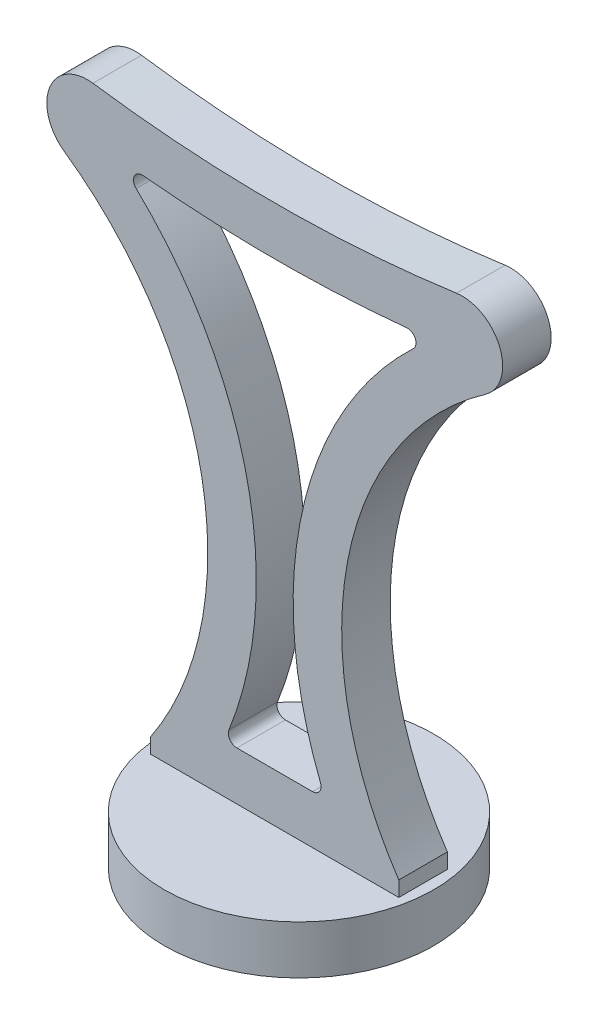
ISO-10303-21;
HEADER;
FILE_DESCRIPTION(('STEP AP214'),'2;1');
FILE_NAME('part.step','',(''),(''),'','','');
FILE_SCHEMA(('AUTOMOTIVE_DESIGN { 1 0 10303 214 1 1 1 1 }'));
ENDSEC;
DATA;
#1=APPLICATION_CONTEXT('core data for automotive mechanical design processes');
#2=APPLICATION_PROTOCOL_DEFINITION('international standard','automotive_design',2000,#1);
#3=PRODUCT_CONTEXT('',#1,'mechanical');
#4=PRODUCT('Part','Part','',(#3));
#5=PRODUCT_RELATED_PRODUCT_CATEGORY('part','',(#4));
#6=PRODUCT_DEFINITION_FORMATION('','',#4);
#7=PRODUCT_DEFINITION_CONTEXT('part definition',#1,'design');
#8=PRODUCT_DEFINITION('design','',#6,#7);
#9=PRODUCT_DEFINITION_SHAPE('','',#8);
#10=(LENGTH_UNIT() NAMED_UNIT(*) SI_UNIT(.MILLI.,.METRE.));
#11=(NAMED_UNIT(*) PLANE_ANGLE_UNIT() SI_UNIT($,.RADIAN.));
#12=(NAMED_UNIT(*) SI_UNIT($,.STERADIAN.) SOLID_ANGLE_UNIT());
#13=UNCERTAINTY_MEASURE_WITH_UNIT(LENGTH_MEASURE(1.E-05),#10,'distance_accuracy_value','');
#14=(GEOMETRIC_REPRESENTATION_CONTEXT(3) GLOBAL_UNCERTAINTY_ASSIGNED_CONTEXT((#13)) GLOBAL_UNIT_ASSIGNED_CONTEXT((#10,
#11,#12)) REPRESENTATION_CONTEXT('',''));
#15=CARTESIAN_POINT('',(0.,0.,0.));
#16=DIRECTION('',(0.,0.,1.));
#17=DIRECTION('',(1.,0.,0.));
#18=AXIS2_PLACEMENT_3D('',#15,#16,#17);
#19=CARTESIAN_POINT('',(149.830756772071,93.2251287956063,9.));
#20=DIRECTION('',(0.,0.,-1.));
#21=DIRECTION('',(-1.,0.,0.));
#22=AXIS2_PLACEMENT_3D('',#19,#20,#21);
#23=CYLINDRICAL_SURFACE('',#22,125.);
#24=CARTESIAN_POINT('',(149.830756772071,93.2251287956063,-9.));
#25=DIRECTION('',(0.,0.,-1.));
#26=DIRECTION('',(-1.,0.,0.));
#27=AXIS2_PLACEMENT_3D('',#24,#25,#26);
#28=CIRCLE('',#27,125.);
#29=CARTESIAN_POINT('',(46.,23.6250285935305,-9.));
#30=VERTEX_POINT('',#29);
#31=CARTESIAN_POINT('',(78.1037289432422,195.598140272472,-9.));
#32=VERTEX_POINT('',#31);
#33=EDGE_CURVE('E249',#30,#32,#28,.T.);
#34=ORIENTED_EDGE('',*,*,#33,.T.);
#35=DIRECTION('',(0.,0.,-1.));
#36=VECTOR('',#35,1.);
#37=CARTESIAN_POINT('',(78.1037289432422,195.598140272472,9.));
#38=LINE('',#37,#36);
#39=CARTESIAN_POINT('',(78.1037289432422,195.598140272472,9.));
#40=VERTEX_POINT('',#39);
#41=EDGE_CURVE('E403',#40,#32,#38,.T.);
#42=ORIENTED_EDGE('',*,*,#41,.F.);
#43=CARTESIAN_POINT('',(149.830756772071,93.2251287956063,9.));
#44=DIRECTION('',(0.,0.,-1.));
#45=DIRECTION('',(-1.,0.,0.));
#46=AXIS2_PLACEMENT_3D('',#43,#44,#45);
#47=CIRCLE('',#46,125.);
#48=CARTESIAN_POINT('',(46.,23.6250285935305,9.));
#49=VERTEX_POINT('',#48);
#50=EDGE_CURVE('E266',#49,#40,#47,.T.);
#51=ORIENTED_EDGE('',*,*,#50,.F.);
#52=DIRECTION('',(0.,0.,-1.));
#53=VECTOR('',#52,1.);
#54=CARTESIAN_POINT('',(46.,23.6250285935305,9.));
#55=LINE('',#54,#53);
#56=EDGE_CURVE('E310',#49,#30,#55,.T.);
#57=ORIENTED_EDGE('',*,*,#56,.T.);
#58=EDGE_LOOP('',(#34,#42,#51,#57));
#59=FACE_BOUND('',#58,.T.);
#60=ADVANCED_FACE('F53',(#59),#23,.F.);
#61=CARTESIAN_POINT('',(69.4964856037827,207.882901649695,9.));
#62=DIRECTION('',(0.,0.,-1.));
#63=DIRECTION('',(-1.,0.,0.));
#64=AXIS2_PLACEMENT_3D('',#61,#62,#63);
#65=CYLINDRICAL_SURFACE('',#64,15.);
#66=CARTESIAN_POINT('',(69.4964856037827,207.882901649695,-9.));
#67=DIRECTION('',(0.,0.,1.));
#68=DIRECTION('',(-1.,0.,0.));
#69=AXIS2_PLACEMENT_3D('',#66,#67,#68);
#70=CIRCLE('',#69,15.);
#71=CARTESIAN_POINT('',(67.3990061590006,222.735530372542,-9.));
#72=VERTEX_POINT('',#71);
#73=EDGE_CURVE('E314',#32,#72,#70,.T.);
#74=ORIENTED_EDGE('',*,*,#73,.T.);
#75=DIRECTION('',(0.,0.,-1.));
#76=VECTOR('',#75,1.);
#77=CARTESIAN_POINT('',(67.3990061590006,222.735530372542,9.));
#78=LINE('',#77,#76);
#79=CARTESIAN_POINT('',(67.3990061590006,222.735530372542,9.));
#80=VERTEX_POINT('',#79);
#81=EDGE_CURVE('E399',#80,#72,#78,.T.);
#82=ORIENTED_EDGE('',*,*,#81,.F.);
#83=CARTESIAN_POINT('',(69.4964856037827,207.882901649695,9.));
#84=DIRECTION('',(0.,0.,1.));
#85=DIRECTION('',(-1.,0.,0.));
#86=AXIS2_PLACEMENT_3D('',#83,#84,#85);
#87=CIRCLE('',#86,15.);
#88=EDGE_CURVE('E270',#40,#80,#87,.T.);
#89=ORIENTED_EDGE('',*,*,#88,.F.);
#90=ORIENTED_EDGE('',*,*,#41,.T.);
#91=EDGE_LOOP('',(#74,#82,#89,#90));
#92=FACE_BOUND('',#91,.T.);
#93=ADVANCED_FACE('F464',(#92),#65,.T.);
#94=CARTESIAN_POINT('',(0.,700.,9.));
#95=DIRECTION('',(0.,0.,-1.));
#96=DIRECTION('',(-1.,0.,0.));
#97=AXIS2_PLACEMENT_3D('',#94,#95,#96);
#98=CYLINDRICAL_SURFACE('',#97,482.);
#99=CARTESIAN_POINT('',(0.,700.,-9.));
#100=DIRECTION('',(0.,0.,-1.));
#101=DIRECTION('',(1.,0.,0.));
#102=AXIS2_PLACEMENT_3D('',#99,#100,#101);
#103=CIRCLE('',#102,482.);
#104=CARTESIAN_POINT('',(-67.3990061590005,222.735530372542,-9.));
#105=VERTEX_POINT('',#104);
#106=EDGE_CURVE('E317',#72,#105,#103,.T.);
#107=ORIENTED_EDGE('',*,*,#106,.T.);
#108=DIRECTION('',(0.,0.,-1.));
#109=VECTOR('',#108,1.);
#110=CARTESIAN_POINT('',(-67.3990061590005,222.735530372542,9.));
#111=LINE('',#110,#109);
#112=CARTESIAN_POINT('',(-67.3990061590005,222.735530372542,9.));
#113=VERTEX_POINT('',#112);
#114=EDGE_CURVE('E395',#113,#105,#111,.T.);
#115=ORIENTED_EDGE('',*,*,#114,.F.);
#116=CARTESIAN_POINT('',(0.,700.,9.));
#117=DIRECTION('',(0.,0.,-1.));
#118=DIRECTION('',(1.,0.,0.));
#119=AXIS2_PLACEMENT_3D('',#116,#117,#118);
#120=CIRCLE('',#119,482.);
#121=EDGE_CURVE('E274',#80,#113,#120,.T.);
#122=ORIENTED_EDGE('',*,*,#121,.F.);
#123=ORIENTED_EDGE('',*,*,#81,.T.);
#124=EDGE_LOOP('',(#107,#115,#122,#123));
#125=FACE_BOUND('',#124,.T.);
#126=ADVANCED_FACE('F469',(#125),#98,.F.);
#127=CARTESIAN_POINT('',(-69.4964856037827,207.882901649695,9.));
#128=DIRECTION('',(0.,0.,-1.));
#129=DIRECTION('',(-1.,0.,0.));
#130=AXIS2_PLACEMENT_3D('',#127,#128,#129);
#131=CYLINDRICAL_SURFACE('',#130,15.);
#132=CARTESIAN_POINT('',(-69.4964856037827,207.882901649695,-9.));
#133=DIRECTION('',(0.,0.,1.));
#134=DIRECTION('',(1.,0.,0.));
#135=AXIS2_PLACEMENT_3D('',#132,#133,#134);
#136=CIRCLE('',#135,15.);
#137=CARTESIAN_POINT('',(-78.1037289432423,195.598140272472,-9.));
#138=VERTEX_POINT('',#137);
#139=EDGE_CURVE('E320',#105,#138,#136,.T.);
#140=ORIENTED_EDGE('',*,*,#139,.T.);
#141=DIRECTION('',(0.,0.,-1.));
#142=VECTOR('',#141,1.);
#143=CARTESIAN_POINT('',(-78.1037289432423,195.598140272472,9.));
#144=LINE('',#143,#142);
#145=CARTESIAN_POINT('',(-78.1037289432423,195.598140272472,9.));
#146=VERTEX_POINT('',#145);
#147=EDGE_CURVE('E391',#146,#138,#144,.T.);
#148=ORIENTED_EDGE('',*,*,#147,.F.);
#149=CARTESIAN_POINT('',(-69.4964856037827,207.882901649695,9.));
#150=DIRECTION('',(0.,0.,1.));
#151=DIRECTION('',(1.,0.,0.));
#152=AXIS2_PLACEMENT_3D('',#149,#150,#151);
#153=CIRCLE('',#152,15.);
#154=EDGE_CURVE('E277',#113,#146,#153,.T.);
#155=ORIENTED_EDGE('',*,*,#154,.F.);
#156=ORIENTED_EDGE('',*,*,#114,.T.);
#157=EDGE_LOOP('',(#140,#148,#155,#156));
#158=FACE_BOUND('',#157,.T.);
#159=ADVANCED_FACE('F531',(#158),#131,.T.);
#160=CARTESIAN_POINT('',(-149.830756772071,93.2251287956063,9.));
#161=DIRECTION('',(0.,0.,-1.));
#162=DIRECTION('',(-1.,0.,0.));
#163=AXIS2_PLACEMENT_3D('',#160,#161,#162);
#164=CYLINDRICAL_SURFACE('',#163,125.);
#165=CARTESIAN_POINT('',(-149.830756772071,93.2251287956063,-9.));
#166=DIRECTION('',(0.,0.,-1.));
#167=DIRECTION('',(1.,0.,0.));
#168=AXIS2_PLACEMENT_3D('',#165,#166,#167);
#169=CIRCLE('',#168,125.);
#170=CARTESIAN_POINT('',(-46.,23.6250285935305,-9.));
#171=VERTEX_POINT('',#170);
#172=EDGE_CURVE('E323',#138,#171,#169,.T.);
#173=ORIENTED_EDGE('',*,*,#172,.T.);
#174=DIRECTION('',(0.,0.,-1.));
#175=VECTOR('',#174,1.);
#176=CARTESIAN_POINT('',(-46.,23.6250285935305,9.));
#177=LINE('',#176,#175);
#178=CARTESIAN_POINT('',(-46.,23.6250285935305,9.));
#179=VERTEX_POINT('',#178);
#180=EDGE_CURVE('E387',#179,#171,#177,.T.);
#181=ORIENTED_EDGE('',*,*,#180,.F.);
#182=CARTESIAN_POINT('',(-149.830756772071,93.2251287956063,9.));
#183=DIRECTION('',(0.,0.,-1.));
#184=DIRECTION('',(1.,0.,0.));
#185=AXIS2_PLACEMENT_3D('',#182,#183,#184);
#186=CIRCLE('',#185,125.);
#187=EDGE_CURVE('E280',#146,#179,#186,.T.);
#188=ORIENTED_EDGE('',*,*,#187,.F.);
#189=ORIENTED_EDGE('',*,*,#147,.T.);
#190=EDGE_LOOP('',(#173,#181,#188,#189));
#191=FACE_BOUND('',#190,.T.);
#192=ADVANCED_FACE('F527',(#191),#164,.F.);
#193=CARTESIAN_POINT('',(-46.,23.6250285935305,9.));
#194=DIRECTION('',(1.,0.,0.));
#195=DIRECTION('',(0.,1.,0.));
#196=AXIS2_PLACEMENT_3D('',#193,#194,#195);
#197=PLANE('',#196);
#198=DIRECTION('',(0.,-1.,0.));
#199=VECTOR('',#198,1.);
#200=CARTESIAN_POINT('',(-46.,23.6250285935305,-9.));
#201=LINE('',#200,#199);
#202=CARTESIAN_POINT('',(-46.,18.,-9.));
#203=VERTEX_POINT('',#202);
#204=EDGE_CURVE('E326',#171,#203,#201,.T.);
#205=ORIENTED_EDGE('',*,*,#204,.T.);
#206=DIRECTION('',(0.,0.,-1.));
#207=VECTOR('',#206,1.);
#208=CARTESIAN_POINT('',(-46.,18.,9.));
#209=LINE('',#208,#207);
#210=CARTESIAN_POINT('',(-46.,18.,9.));
#211=VERTEX_POINT('',#210);
#212=EDGE_CURVE('E383',#211,#203,#209,.T.);
#213=ORIENTED_EDGE('',*,*,#212,.F.);
#214=DIRECTION('',(0.,-1.,0.));
#215=VECTOR('',#214,1.);
#216=CARTESIAN_POINT('',(-46.,23.6250285935305,9.));
#217=LINE('',#216,#215);
#218=EDGE_CURVE('E283',#179,#211,#217,.T.);
#219=ORIENTED_EDGE('',*,*,#218,.F.);
#220=ORIENTED_EDGE('',*,*,#180,.T.);
#221=EDGE_LOOP('',(#205,#213,#219,#220));
#222=FACE_BOUND('',#221,.T.);
#223=ADVANCED_FACE('F522',(#222),#197,.F.);
#224=CARTESIAN_POINT('',(-18.175,18.,9.));
#225=DIRECTION('',(0.,1.,0.));
#226=DIRECTION('',(0.,0.,1.));
#227=AXIS2_PLACEMENT_3D('',#224,#225,#226);
#228=PLANE('',#227);
#229=DIRECTION('',(1.,0.,0.));
#230=VECTOR('',#229,1.);
#231=CARTESIAN_POINT('',(-18.175,18.,-9.));
#232=LINE('',#231,#230);
#233=CARTESIAN_POINT('',(-18.175,18.,-9.));
#234=VERTEX_POINT('',#233);
#235=EDGE_CURVE('E329',#203,#234,#232,.T.);
#236=ORIENTED_EDGE('',*,*,#235,.T.);
#237=DIRECTION('',(0.,0.,-1.));
#238=VECTOR('',#237,1.);
#239=CARTESIAN_POINT('',(-18.175,18.,9.));
#240=LINE('',#239,#238);
#241=CARTESIAN_POINT('',(-18.175,18.,9.));
#242=VERTEX_POINT('',#241);
#243=EDGE_CURVE('E379',#242,#234,#240,.T.);
#244=ORIENTED_EDGE('',*,*,#243,.F.);
#245=DIRECTION('',(1.,0.,0.));
#246=VECTOR('',#245,1.);
#247=CARTESIAN_POINT('',(-18.175,18.,9.));
#248=LINE('',#247,#246);
#249=EDGE_CURVE('E286',#211,#242,#248,.T.);
#250=ORIENTED_EDGE('',*,*,#249,.F.);
#251=ORIENTED_EDGE('',*,*,#212,.T.);
#252=EDGE_LOOP('',(#236,#244,#250,#251));
#253=FACE_BOUND('',#252,.T.);
#254=ADVANCED_FACE('F517',(#253),#228,.F.);
#255=CARTESIAN_POINT('',(-18.175,14.825,9.));
#256=DIRECTION('',(0.,0.,-1.));
#257=DIRECTION('',(-1.,0.,0.));
#258=AXIS2_PLACEMENT_3D('',#255,#256,#257);
#259=CYLINDRICAL_SURFACE('',#258,3.175);
#260=CARTESIAN_POINT('',(-18.175,14.825,-9.));
#261=DIRECTION('',(0.,0.,-1.));
#262=DIRECTION('',(1.,0.,0.));
#263=AXIS2_PLACEMENT_3D('',#260,#261,#262);
#264=CIRCLE('',#263,3.175);
#265=CARTESIAN_POINT('',(-15.,14.825,-9.));
#266=VERTEX_POINT('',#265);
#267=EDGE_CURVE('E332',#234,#266,#264,.T.);
#268=ORIENTED_EDGE('',*,*,#267,.T.);
#269=DIRECTION('',(0.,0.,-1.));
#270=VECTOR('',#269,1.);
#271=CARTESIAN_POINT('',(-15.,14.825,9.));
#272=LINE('',#271,#270);
#273=CARTESIAN_POINT('',(-15.,14.825,9.));
#274=VERTEX_POINT('',#273);
#275=EDGE_CURVE('E375',#274,#266,#272,.T.);
#276=ORIENTED_EDGE('',*,*,#275,.F.);
#277=CARTESIAN_POINT('',(-18.175,14.825,9.));
#278=DIRECTION('',(0.,0.,-1.));
#279=DIRECTION('',(1.,0.,0.));
#280=AXIS2_PLACEMENT_3D('',#277,#278,#279);
#281=CIRCLE('',#280,3.175);
#282=EDGE_CURVE('E289',#242,#274,#281,.T.);
#283=ORIENTED_EDGE('',*,*,#282,.F.);
#284=ORIENTED_EDGE('',*,*,#243,.T.);
#285=EDGE_LOOP('',(#268,#276,#283,#284));
#286=FACE_BOUND('',#285,.T.);
#287=ADVANCED_FACE('F513',(#286),#259,.F.);
#288=CARTESIAN_POINT('',(-15.,14.825,9.));
#289=DIRECTION('',(1.,0.,0.));
#290=DIRECTION('',(0.,1.,0.));
#291=AXIS2_PLACEMENT_3D('',#288,#289,#290);
#292=PLANE('',#291);
#293=DIRECTION('',(0.,-1.,0.));
#294=VECTOR('',#293,1.);
#295=CARTESIAN_POINT('',(-15.,14.825,-9.));
#296=LINE('',#295,#294);
#297=CARTESIAN_POINT('',(-15.,0.,-9.));
#298=VERTEX_POINT('',#297);
#299=EDGE_CURVE('E335',#266,#298,#296,.T.);
#300=ORIENTED_EDGE('',*,*,#299,.T.);
#301=DIRECTION('',(0.,0.,-1.));
#302=VECTOR('',#301,1.);
#303=CARTESIAN_POINT('',(-15.,0.,9.));
#304=LINE('',#303,#302);
#305=CARTESIAN_POINT('',(-15.,0.,9.));
#306=VERTEX_POINT('',#305);
#307=EDGE_CURVE('E371',#306,#298,#304,.T.);
#308=ORIENTED_EDGE('',*,*,#307,.F.);
#309=DIRECTION('',(0.,-1.,0.));
#310=VECTOR('',#309,1.);
#311=CARTESIAN_POINT('',(-15.,14.825,9.));
#312=LINE('',#311,#310);
#313=EDGE_CURVE('E292',#274,#306,#312,.T.);
#314=ORIENTED_EDGE('',*,*,#313,.F.);
#315=ORIENTED_EDGE('',*,*,#275,.T.);
#316=EDGE_LOOP('',(#300,#308,#314,#315));
#317=FACE_BOUND('',#316,.T.);
#318=ADVANCED_FACE('F508',(#317),#292,.F.);
#319=CARTESIAN_POINT('',(-15.,0.,9.));
#320=DIRECTION('',(0.,1.,0.));
#321=DIRECTION('',(0.,0.,1.));
#322=AXIS2_PLACEMENT_3D('',#319,#320,#321);
#323=PLANE('',#322);
#324=DIRECTION('',(1.,0.,0.));
#325=VECTOR('',#324,1.);
#326=CARTESIAN_POINT('',(-15.,0.,-9.));
#327=LINE('',#326,#325);
#328=CARTESIAN_POINT('',(15.,0.,-9.));
#329=VERTEX_POINT('',#328);
#330=EDGE_CURVE('E338',#298,#329,#327,.T.);
#331=ORIENTED_EDGE('',*,*,#330,.T.);
#332=DIRECTION('',(0.,0.,-1.));
#333=VECTOR('',#332,1.);
#334=CARTESIAN_POINT('',(15.,0.,9.));
#335=LINE('',#334,#333);
#336=CARTESIAN_POINT('',(15.,0.,9.));
#337=VERTEX_POINT('',#336);
#338=EDGE_CURVE('E367',#337,#329,#335,.T.);
#339=ORIENTED_EDGE('',*,*,#338,.F.);
#340=DIRECTION('',(1.,0.,0.));
#341=VECTOR('',#340,1.);
#342=CARTESIAN_POINT('',(-15.,0.,9.));
#343=LINE('',#342,#341);
#344=EDGE_CURVE('E295',#306,#337,#343,.T.);
#345=ORIENTED_EDGE('',*,*,#344,.F.);
#346=ORIENTED_EDGE('',*,*,#307,.T.);
#347=EDGE_LOOP('',(#331,#339,#345,#346));
#348=FACE_BOUND('',#347,.T.);
#349=ADVANCED_FACE('F502',(#348),#323,.F.);
#350=CARTESIAN_POINT('',(15.,0.,9.));
#351=DIRECTION('',(-1.,0.,0.));
#352=DIRECTION('',(0.,0.,1.));
#353=AXIS2_PLACEMENT_3D('',#350,#351,#352);
#354=PLANE('',#353);
#355=DIRECTION('',(0.,1.,0.));
#356=VECTOR('',#355,1.);
#357=CARTESIAN_POINT('',(15.,0.,-9.));
#358=LINE('',#357,#356);
#359=CARTESIAN_POINT('',(15.,14.825,-9.));
#360=VERTEX_POINT('',#359);
#361=EDGE_CURVE('E341',#329,#360,#358,.T.);
#362=ORIENTED_EDGE('',*,*,#361,.T.);
#363=DIRECTION('',(0.,0.,-1.));
#364=VECTOR('',#363,1.);
#365=CARTESIAN_POINT('',(15.,14.825,9.));
#366=LINE('',#365,#364);
#367=CARTESIAN_POINT('',(15.,14.825,9.));
#368=VERTEX_POINT('',#367);
#369=EDGE_CURVE('E363',#368,#360,#366,.T.);
#370=ORIENTED_EDGE('',*,*,#369,.F.);
#371=DIRECTION('',(0.,1.,0.));
#372=VECTOR('',#371,1.);
#373=CARTESIAN_POINT('',(15.,0.,9.));
#374=LINE('',#373,#372);
#375=EDGE_CURVE('E298',#337,#368,#374,.T.);
#376=ORIENTED_EDGE('',*,*,#375,.F.);
#377=ORIENTED_EDGE('',*,*,#338,.T.);
#378=EDGE_LOOP('',(#362,#370,#376,#377));
#379=FACE_BOUND('',#378,.T.);
#380=ADVANCED_FACE('F498',(#379),#354,.F.);
#381=CARTESIAN_POINT('',(18.175,14.825,9.));
#382=DIRECTION('',(0.,0.,-1.));
#383=DIRECTION('',(-1.,0.,0.));
#384=AXIS2_PLACEMENT_3D('',#381,#382,#383);
#385=CYLINDRICAL_SURFACE('',#384,3.175);
#386=CARTESIAN_POINT('',(18.175,14.825,-9.));
#387=DIRECTION('',(0.,0.,-1.));
#388=DIRECTION('',(-1.,0.,0.));
#389=AXIS2_PLACEMENT_3D('',#386,#387,#388);
#390=CIRCLE('',#389,3.175);
#391=CARTESIAN_POINT('',(18.175,18.,-9.));
#392=VERTEX_POINT('',#391);
#393=EDGE_CURVE('E344',#360,#392,#390,.T.);
#394=ORIENTED_EDGE('',*,*,#393,.T.);
#395=DIRECTION('',(0.,0.,-1.));
#396=VECTOR('',#395,1.);
#397=CARTESIAN_POINT('',(18.175,18.,9.));
#398=LINE('',#397,#396);
#399=CARTESIAN_POINT('',(18.175,18.,9.));
#400=VERTEX_POINT('',#399);
#401=EDGE_CURVE('E359',#400,#392,#398,.T.);
#402=ORIENTED_EDGE('',*,*,#401,.F.);
#403=CARTESIAN_POINT('',(18.175,14.825,9.));
#404=DIRECTION('',(0.,0.,-1.));
#405=DIRECTION('',(-1.,0.,0.));
#406=AXIS2_PLACEMENT_3D('',#403,#404,#405);
#407=CIRCLE('',#406,3.175);
#408=EDGE_CURVE('E301',#368,#400,#407,.T.);
#409=ORIENTED_EDGE('',*,*,#408,.F.);
#410=ORIENTED_EDGE('',*,*,#369,.T.);
#411=EDGE_LOOP('',(#394,#402,#409,#410));
#412=FACE_BOUND('',#411,.T.);
#413=ADVANCED_FACE('F493',(#412),#385,.F.);
#414=CARTESIAN_POINT('',(46.,18.,9.));
#415=DIRECTION('',(0.,1.,0.));
#416=DIRECTION('',(-1.,0.,0.));
#417=AXIS2_PLACEMENT_3D('',#414,#415,#416);
#418=PLANE('',#417);
#419=DIRECTION('',(1.,0.,0.));
#420=VECTOR('',#419,1.);
#421=CARTESIAN_POINT('',(46.,18.,-9.));
#422=LINE('',#421,#420);
#423=CARTESIAN_POINT('',(46.,18.,-9.));
#424=VERTEX_POINT('',#423);
#425=EDGE_CURVE('E347',#392,#424,#422,.T.);
#426=ORIENTED_EDGE('',*,*,#425,.T.);
#427=DIRECTION('',(0.,0.,-1.));
#428=VECTOR('',#427,1.);
#429=CARTESIAN_POINT('',(46.,18.,9.));
#430=LINE('',#429,#428);
#431=CARTESIAN_POINT('',(46.,18.,9.));
#432=VERTEX_POINT('',#431);
#433=EDGE_CURVE('E355',#432,#424,#430,.T.);
#434=ORIENTED_EDGE('',*,*,#433,.F.);
#435=DIRECTION('',(1.,0.,0.));
#436=VECTOR('',#435,1.);
#437=CARTESIAN_POINT('',(46.,18.,9.));
#438=LINE('',#437,#436);
#439=EDGE_CURVE('E304',#400,#432,#438,.T.);
#440=ORIENTED_EDGE('',*,*,#439,.F.);
#441=ORIENTED_EDGE('',*,*,#401,.T.);
#442=EDGE_LOOP('',(#426,#434,#440,#441));
#443=FACE_BOUND('',#442,.T.);
#444=ADVANCED_FACE('F487',(#443),#418,.F.);
#445=CARTESIAN_POINT('',(46.,23.6250285935305,9.));
#446=DIRECTION('',(-1.,0.,0.));
#447=DIRECTION('',(0.,-1.,0.));
#448=AXIS2_PLACEMENT_3D('',#445,#446,#447);
#449=PLANE('',#448);
#450=DIRECTION('',(0.,1.,0.));
#451=VECTOR('',#450,1.);
#452=CARTESIAN_POINT('',(46.,23.6250285935305,-9.));
#453=LINE('',#452,#451);
#454=EDGE_CURVE('E271',#424,#30,#453,.T.);
#455=ORIENTED_EDGE('',*,*,#454,.T.);
#456=ORIENTED_EDGE('',*,*,#56,.F.);
#457=DIRECTION('',(0.,1.,0.));
#458=VECTOR('',#457,1.);
#459=CARTESIAN_POINT('',(46.,23.6250285935305,9.));
#460=LINE('',#459,#458);
#461=EDGE_CURVE('E307',#432,#49,#460,.T.);
#462=ORIENTED_EDGE('',*,*,#461,.F.);
#463=ORIENTED_EDGE('',*,*,#433,.T.);
#464=EDGE_LOOP('',(#455,#456,#462,#463));
#465=FACE_BOUND('',#464,.T.);
#466=ADVANCED_FACE('F485',(#465),#449,.F.);
#467=CARTESIAN_POINT('',(149.830756772071,93.2251287956063,9.));
#468=DIRECTION('',(0.,0.,-1.));
#469=DIRECTION('',(-1.,0.,0.));
#470=AXIS2_PLACEMENT_3D('',#467,#468,#469);
#471=PLANE('',#470);
#472=CARTESIAN_POINT('',(49.1875512893508,199.234919924364,9.));
#473=DIRECTION('',(0.,0.,1.));
#474=DIRECTION('',(1.,0.,0.));
#475=AXIS2_PLACEMENT_3D('',#472,#473,#474);
#476=CIRCLE('',#475,3.17500000000004);
#477=CARTESIAN_POINT('',(51.373576104864,196.932329968258,9.));
#478=VERTEX_POINT('',#477);
#479=CARTESIAN_POINT('',(48.8771811888018,202.39471349368,9.));
#480=VERTEX_POINT('',#479);
#481=EDGE_CURVE('E214',#478,#480,#476,.T.);
#482=ORIENTED_EDGE('',*,*,#481,.F.);
#483=CARTESIAN_POINT('',(149.830756772071,93.2251287956063,9.));
#484=DIRECTION('',(0.,0.,-1.));
#485=DIRECTION('',(1.,0.,0.));
#486=AXIS2_PLACEMENT_3D('',#483,#484,#485);
#487=CIRCLE('',#486,143.);
#488=CARTESIAN_POINT('',(16.9657320552214,40.3489980087296,9.));
#489=VERTEX_POINT('',#488);
#490=EDGE_CURVE('E68',#489,#478,#487,.T.);
#491=ORIENTED_EDGE('',*,*,#490,.F.);
#492=CARTESIAN_POINT('',(14.0157568560885,39.175,9.));
#493=DIRECTION('',(0.,0.,1.));
#494=DIRECTION('',(-1.,0.,0.));
#495=AXIS2_PLACEMENT_3D('',#492,#493,#494);
#496=CIRCLE('',#495,3.175);
#497=CARTESIAN_POINT('',(14.0157568560885,36.,9.));
#498=VERTEX_POINT('',#497);
#499=EDGE_CURVE('E242',#498,#489,#496,.T.);
#500=ORIENTED_EDGE('',*,*,#499,.F.);
#501=DIRECTION('',(1.,0.,0.));
#502=VECTOR('',#501,1.);
#503=CARTESIAN_POINT('',(-14.0157568560885,36.,9.));
#504=LINE('',#503,#502);
#505=CARTESIAN_POINT('',(-14.0157568560885,36.,9.));
#506=VERTEX_POINT('',#505);
#507=EDGE_CURVE('E238',#506,#498,#504,.T.);
#508=ORIENTED_EDGE('',*,*,#507,.F.);
#509=CARTESIAN_POINT('',(-14.0157568560885,39.175,9.));
#510=DIRECTION('',(0.,0.,1.));
#511=DIRECTION('',(1.,0.,0.));
#512=AXIS2_PLACEMENT_3D('',#509,#510,#511);
#513=CIRCLE('',#512,3.17500000000001);
#514=CARTESIAN_POINT('',(-16.9657320552214,40.3489980087296,9.));
#515=VERTEX_POINT('',#514);
#516=EDGE_CURVE('E234',#515,#506,#513,.T.);
#517=ORIENTED_EDGE('',*,*,#516,.F.);
#518=CARTESIAN_POINT('',(-149.830756772071,93.2251287956063,9.));
#519=DIRECTION('',(0.,0.,-1.));
#520=DIRECTION('',(1.,0.,0.));
#521=AXIS2_PLACEMENT_3D('',#518,#519,#520);
#522=CIRCLE('',#521,143.);
#523=CARTESIAN_POINT('',(-51.3735761048641,196.932329968258,9.));
#524=VERTEX_POINT('',#523);
#525=EDGE_CURVE('E227',#524,#515,#522,.T.);
#526=ORIENTED_EDGE('',*,*,#525,.F.);
#527=CARTESIAN_POINT('',(-49.187551289351,199.234919924365,9.));
#528=DIRECTION('',(0.,0.,1.));
#529=DIRECTION('',(1.,0.,0.));
#530=AXIS2_PLACEMENT_3D('',#527,#528,#529);
#531=CIRCLE('',#530,3.17500000000008);
#532=CARTESIAN_POINT('',(-48.8771811888021,202.39471349368,9.));
#533=VERTEX_POINT('',#532);
#534=EDGE_CURVE('E223',#533,#524,#531,.T.);
#535=ORIENTED_EDGE('',*,*,#534,.F.);
#536=CARTESIAN_POINT('',(0.,700.,9.));
#537=DIRECTION('',(0.,0.,-1.));
#538=DIRECTION('',(1.,0.,0.));
#539=AXIS2_PLACEMENT_3D('',#536,#537,#538);
#540=CIRCLE('',#539,500.);
#541=EDGE_CURVE('E204',#480,#533,#540,.T.);
#542=ORIENTED_EDGE('',*,*,#541,.F.);
#543=EDGE_LOOP('',(#482,#491,#500,#508,#517,#526,#535,#542));
#544=FACE_BOUND('',#543,.T.);
#545=ORIENTED_EDGE('',*,*,#50,.T.);
#546=ORIENTED_EDGE('',*,*,#88,.T.);
#547=ORIENTED_EDGE('',*,*,#121,.T.);
#548=ORIENTED_EDGE('',*,*,#154,.T.);
#549=ORIENTED_EDGE('',*,*,#187,.T.);
#550=ORIENTED_EDGE('',*,*,#218,.T.);
#551=ORIENTED_EDGE('',*,*,#249,.T.);
#552=ORIENTED_EDGE('',*,*,#282,.T.);
#553=ORIENTED_EDGE('',*,*,#313,.T.);
#554=ORIENTED_EDGE('',*,*,#344,.T.);
#555=ORIENTED_EDGE('',*,*,#375,.T.);
#556=ORIENTED_EDGE('',*,*,#408,.T.);
#557=ORIENTED_EDGE('',*,*,#439,.T.);
#558=ORIENTED_EDGE('',*,*,#461,.T.);
#559=EDGE_LOOP('',(#545,#546,#547,#548,#549,#550,#551,#552,#553,#554,#555,#556,#557,#558));
#560=FACE_BOUND('',#559,.T.);
#561=ADVANCED_FACE('F219',(#544,#560),#471,.F.);
#562=CARTESIAN_POINT('',(149.830756772071,93.2251287956063,-9.));
#563=DIRECTION('',(0.,0.,-1.));
#564=DIRECTION('',(-1.,0.,0.));
#565=AXIS2_PLACEMENT_3D('',#562,#563,#564);
#566=PLANE('',#565);
#567=CARTESIAN_POINT('',(149.830756772071,93.2251287956063,-9.));
#568=DIRECTION('',(0.,0.,-1.));
#569=DIRECTION('',(-1.,0.,0.));
#570=AXIS2_PLACEMENT_3D('',#567,#568,#569);
#571=CIRCLE('',#570,143.);
#572=CARTESIAN_POINT('',(51.373576104864,196.932329968258,-9.00000000000001));
#573=VERTEX_POINT('',#572);
#574=CARTESIAN_POINT('',(16.9657320552214,40.3489980087296,-9.00000000000001));
#575=VERTEX_POINT('',#574);
#576=EDGE_CURVE('E12',#573,#575,#571,.F.);
#577=ORIENTED_EDGE('',*,*,#576,.F.);
#578=CARTESIAN_POINT('',(49.1875512893508,199.234919924364,-9.));
#579=DIRECTION('',(0.,0.,-1.));
#580=DIRECTION('',(-1.,0.,0.));
#581=AXIS2_PLACEMENT_3D('',#578,#579,#580);
#582=CIRCLE('',#581,3.17500000000004);
#583=CARTESIAN_POINT('',(48.8771811888018,202.39471349368,-9.));
#584=VERTEX_POINT('',#583);
#585=EDGE_CURVE('E407',#584,#573,#582,.T.);
#586=ORIENTED_EDGE('',*,*,#585,.F.);
#587=CARTESIAN_POINT('',(0.,700.,-9.));
#588=DIRECTION('',(0.,0.,-1.));
#589=DIRECTION('',(-1.,0.,0.));
#590=AXIS2_PLACEMENT_3D('',#587,#588,#589);
#591=CIRCLE('',#590,500.);
#592=CARTESIAN_POINT('',(-48.8771811888021,202.39471349368,-9.00000000000001));
#593=VERTEX_POINT('',#592);
#594=EDGE_CURVE('E207',#593,#584,#591,.F.);
#595=ORIENTED_EDGE('',*,*,#594,.F.);
#596=CARTESIAN_POINT('',(-49.187551289351,199.234919924365,-9.));
#597=DIRECTION('',(0.,0.,-1.));
#598=DIRECTION('',(-1.,0.,0.));
#599=AXIS2_PLACEMENT_3D('',#596,#597,#598);
#600=CIRCLE('',#599,3.17500000000008);
#601=CARTESIAN_POINT('',(-51.3735761048641,196.932329968258,-9.00000000000001));
#602=VERTEX_POINT('',#601);
#603=EDGE_CURVE('E412',#602,#593,#600,.T.);
#604=ORIENTED_EDGE('',*,*,#603,.F.);
#605=CARTESIAN_POINT('',(-149.830756772071,93.2251287956063,-9.));
#606=DIRECTION('',(0.,0.,-1.));
#607=DIRECTION('',(-1.,0.,0.));
#608=AXIS2_PLACEMENT_3D('',#605,#606,#607);
#609=CIRCLE('',#608,143.);
#610=CARTESIAN_POINT('',(-16.9657320552214,40.3489980087296,-9.00000000000001));
#611=VERTEX_POINT('',#610);
#612=EDGE_CURVE('E415',#611,#602,#609,.F.);
#613=ORIENTED_EDGE('',*,*,#612,.F.);
#614=CARTESIAN_POINT('',(-14.0157568560885,39.175,-9.));
#615=DIRECTION('',(0.,0.,-1.));
#616=DIRECTION('',(-1.,0.,0.));
#617=AXIS2_PLACEMENT_3D('',#614,#615,#616);
#618=CIRCLE('',#617,3.17500000000001);
#619=CARTESIAN_POINT('',(-14.0157568560885,36.,-9.00000000000001));
#620=VERTEX_POINT('',#619);
#621=EDGE_CURVE('E418',#620,#611,#618,.T.);
#622=ORIENTED_EDGE('',*,*,#621,.F.);
#623=DIRECTION('',(-1.,0.,0.));
#624=VECTOR('',#623,1.);
#625=CARTESIAN_POINT('',(149.830756772071,36.,-9.));
#626=LINE('',#625,#624);
#627=CARTESIAN_POINT('',(14.0157568560885,36.,-9.00000000000001));
#628=VERTEX_POINT('',#627);
#629=EDGE_CURVE('E421',#628,#620,#626,.T.);
#630=ORIENTED_EDGE('',*,*,#629,.F.);
#631=CARTESIAN_POINT('',(14.0157568560885,39.175,-9.));
#632=DIRECTION('',(0.,0.,-1.));
#633=DIRECTION('',(-1.,0.,0.));
#634=AXIS2_PLACEMENT_3D('',#631,#632,#633);
#635=CIRCLE('',#634,3.175);
#636=EDGE_CURVE('E61',#575,#628,#635,.T.);
#637=ORIENTED_EDGE('',*,*,#636,.F.);
#638=EDGE_LOOP('',(#577,#586,#595,#604,#613,#622,#630,#637));
#639=FACE_BOUND('',#638,.T.);
#640=ORIENTED_EDGE('',*,*,#33,.F.);
#641=ORIENTED_EDGE('',*,*,#454,.F.);
#642=ORIENTED_EDGE('',*,*,#425,.F.);
#643=ORIENTED_EDGE('',*,*,#393,.F.);
#644=ORIENTED_EDGE('',*,*,#361,.F.);
#645=ORIENTED_EDGE('',*,*,#330,.F.);
#646=ORIENTED_EDGE('',*,*,#299,.F.);
#647=ORIENTED_EDGE('',*,*,#267,.F.);
#648=ORIENTED_EDGE('',*,*,#235,.F.);
#649=ORIENTED_EDGE('',*,*,#204,.F.);
#650=ORIENTED_EDGE('',*,*,#172,.F.);
#651=ORIENTED_EDGE('',*,*,#139,.F.);
#652=ORIENTED_EDGE('',*,*,#106,.F.);
#653=ORIENTED_EDGE('',*,*,#73,.F.);
#654=EDGE_LOOP('',(#640,#641,#642,#643,#644,#645,#646,#647,#648,#649,#650,#651,#652,#653));
#655=FACE_BOUND('',#654,.T.);
#656=ADVANCED_FACE('F438',(#639,#655),#566,.T.);
#657=CARTESIAN_POINT('',(149.830756772071,93.2251287956063,-50.));
#658=DIRECTION('',(0.,0.,1.));
#659=DIRECTION('',(1.,0.,0.));
#660=AXIS2_PLACEMENT_3D('',#657,#658,#659);
#661=CYLINDRICAL_SURFACE('',#660,143.);
#662=ORIENTED_EDGE('',*,*,#576,.T.);
#663=DIRECTION('',(0.,0.,1.));
#664=VECTOR('',#663,1.);
#665=CARTESIAN_POINT('',(16.9657320552214,40.3489980087296,-50.));
#666=LINE('',#665,#664);
#667=EDGE_CURVE('E246',#575,#489,#666,.T.);
#668=ORIENTED_EDGE('',*,*,#667,.T.);
#669=ORIENTED_EDGE('',*,*,#490,.T.);
#670=DIRECTION('',(0.,0.,1.));
#671=VECTOR('',#670,1.);
#672=CARTESIAN_POINT('',(51.373576104864,196.932329968258,-50.));
#673=LINE('',#672,#671);
#674=EDGE_CURVE('E211',#573,#478,#673,.T.);
#675=ORIENTED_EDGE('',*,*,#674,.F.);
#676=EDGE_LOOP('',(#662,#668,#669,#675));
#677=FACE_BOUND('',#676,.T.);
#678=ADVANCED_FACE('F452',(#677),#661,.T.);
#679=CARTESIAN_POINT('',(14.0157568560885,39.175,-50.));
#680=DIRECTION('',(0.,0.,1.));
#681=DIRECTION('',(1.,0.,0.));
#682=AXIS2_PLACEMENT_3D('',#679,#680,#681);
#683=CYLINDRICAL_SURFACE('',#682,3.175);
#684=ORIENTED_EDGE('',*,*,#636,.T.);
#685=DIRECTION('',(0.,0.,1.));
#686=VECTOR('',#685,1.);
#687=CARTESIAN_POINT('',(14.0157568560885,36.,-50.));
#688=LINE('',#687,#686);
#689=EDGE_CURVE('E250',#628,#498,#688,.T.);
#690=ORIENTED_EDGE('',*,*,#689,.T.);
#691=ORIENTED_EDGE('',*,*,#499,.T.);
#692=ORIENTED_EDGE('',*,*,#667,.F.);
#693=EDGE_LOOP('',(#684,#690,#691,#692));
#694=FACE_BOUND('',#693,.T.);
#695=ADVANCED_FACE('F428',(#694),#683,.F.);
#696=CARTESIAN_POINT('',(-14.0157568560885,36.,-50.));
#697=DIRECTION('',(0.,-1.,0.));
#698=DIRECTION('',(1.,0.,0.));
#699=AXIS2_PLACEMENT_3D('',#696,#697,#698);
#700=PLANE('',#699);
#701=ORIENTED_EDGE('',*,*,#629,.T.);
#702=DIRECTION('',(0.,0.,1.));
#703=VECTOR('',#702,1.);
#704=CARTESIAN_POINT('',(-14.0157568560885,36.,-50.));
#705=LINE('',#704,#703);
#706=EDGE_CURVE('E253',#620,#506,#705,.T.);
#707=ORIENTED_EDGE('',*,*,#706,.T.);
#708=ORIENTED_EDGE('',*,*,#507,.T.);
#709=ORIENTED_EDGE('',*,*,#689,.F.);
#710=EDGE_LOOP('',(#701,#707,#708,#709));
#711=FACE_BOUND('',#710,.T.);
#712=ADVANCED_FACE('F433',(#711),#700,.F.);
#713=CARTESIAN_POINT('',(-14.0157568560885,39.175,-50.));
#714=DIRECTION('',(0.,0.,1.));
#715=DIRECTION('',(1.,0.,0.));
#716=AXIS2_PLACEMENT_3D('',#713,#714,#715);
#717=CYLINDRICAL_SURFACE('',#716,3.17500000000001);
#718=ORIENTED_EDGE('',*,*,#621,.T.);
#719=DIRECTION('',(0.,0.,1.));
#720=VECTOR('',#719,1.);
#721=CARTESIAN_POINT('',(-16.9657320552214,40.3489980087296,-50.));
#722=LINE('',#721,#720);
#723=EDGE_CURVE('E256',#611,#515,#722,.T.);
#724=ORIENTED_EDGE('',*,*,#723,.T.);
#725=ORIENTED_EDGE('',*,*,#516,.T.);
#726=ORIENTED_EDGE('',*,*,#706,.F.);
#727=EDGE_LOOP('',(#718,#724,#725,#726));
#728=FACE_BOUND('',#727,.T.);
#729=ADVANCED_FACE('F444',(#728),#717,.F.);
#730=CARTESIAN_POINT('',(-149.830756772071,93.2251287956063,-50.));
#731=DIRECTION('',(0.,0.,1.));
#732=DIRECTION('',(1.,0.,0.));
#733=AXIS2_PLACEMENT_3D('',#730,#731,#732);
#734=CYLINDRICAL_SURFACE('',#733,143.);
#735=ORIENTED_EDGE('',*,*,#612,.T.);
#736=DIRECTION('',(0.,0.,1.));
#737=VECTOR('',#736,1.);
#738=CARTESIAN_POINT('',(-51.3735761048641,196.932329968258,-50.));
#739=LINE('',#738,#737);
#740=EDGE_CURVE('E259',#602,#524,#739,.T.);
#741=ORIENTED_EDGE('',*,*,#740,.T.);
#742=ORIENTED_EDGE('',*,*,#525,.T.);
#743=ORIENTED_EDGE('',*,*,#723,.F.);
#744=EDGE_LOOP('',(#735,#741,#742,#743));
#745=FACE_BOUND('',#744,.T.);
#746=ADVANCED_FACE('F446',(#745),#734,.T.);
#747=CARTESIAN_POINT('',(-49.187551289351,199.234919924365,-50.));
#748=DIRECTION('',(0.,0.,1.));
#749=DIRECTION('',(1.,0.,0.));
#750=AXIS2_PLACEMENT_3D('',#747,#748,#749);
#751=CYLINDRICAL_SURFACE('',#750,3.17500000000008);
#752=ORIENTED_EDGE('',*,*,#603,.T.);
#753=DIRECTION('',(0.,0.,1.));
#754=VECTOR('',#753,1.);
#755=CARTESIAN_POINT('',(-48.8771811888021,202.39471349368,-50.));
#756=LINE('',#755,#754);
#757=EDGE_CURVE('E210',#593,#533,#756,.T.);
#758=ORIENTED_EDGE('',*,*,#757,.T.);
#759=ORIENTED_EDGE('',*,*,#534,.T.);
#760=ORIENTED_EDGE('',*,*,#740,.F.);
#761=EDGE_LOOP('',(#752,#758,#759,#760));
#762=FACE_BOUND('',#761,.T.);
#763=ADVANCED_FACE('F451',(#762),#751,.F.);
#764=CARTESIAN_POINT('',(0.,700.,-50.));
#765=DIRECTION('',(0.,0.,1.));
#766=DIRECTION('',(1.,0.,0.));
#767=AXIS2_PLACEMENT_3D('',#764,#765,#766);
#768=CYLINDRICAL_SURFACE('',#767,500.);
#769=ORIENTED_EDGE('',*,*,#594,.T.);
#770=DIRECTION('',(0.,0.,1.));
#771=VECTOR('',#770,1.);
#772=CARTESIAN_POINT('',(48.8771811888018,202.39471349368,-50.));
#773=LINE('',#772,#771);
#774=EDGE_CURVE('E76',#584,#480,#773,.T.);
#775=ORIENTED_EDGE('',*,*,#774,.T.);
#776=ORIENTED_EDGE('',*,*,#541,.T.);
#777=ORIENTED_EDGE('',*,*,#757,.F.);
#778=EDGE_LOOP('',(#769,#775,#776,#777));
#779=FACE_BOUND('',#778,.T.);
#780=ADVANCED_FACE('F201',(#779),#768,.T.);
#781=CARTESIAN_POINT('',(49.1875512893508,199.234919924364,-50.));
#782=DIRECTION('',(0.,0.,1.));
#783=DIRECTION('',(1.,0.,0.));
#784=AXIS2_PLACEMENT_3D('',#781,#782,#783);
#785=CYLINDRICAL_SURFACE('',#784,3.17500000000004);
#786=ORIENTED_EDGE('',*,*,#585,.T.);
#787=ORIENTED_EDGE('',*,*,#674,.T.);
#788=ORIENTED_EDGE('',*,*,#481,.T.);
#789=ORIENTED_EDGE('',*,*,#774,.F.);
#790=EDGE_LOOP('',(#786,#787,#788,#789));
#791=FACE_BOUND('',#790,.T.);
#792=ADVANCED_FACE('F215',(#791),#785,.F.);
#793=CLOSED_SHELL('',(#60,#93,#126,#159,#192,#223,#254,#287,#318,#349,#380,#413,#444,#466,#561,
#656,#678,#695,#712,#729,#746,#763,#780,#792));
#794=MANIFOLD_SOLID_BREP('B2',#793);
#795=CARTESIAN_POINT('',(0.,18.,0.));
#796=DIRECTION('',(0.,-1.,0.));
#797=DIRECTION('',(0.,0.,-1.));
#798=AXIS2_PLACEMENT_3D('',#795,#796,#797);
#799=CYLINDRICAL_SURFACE('',#798,50.);
#800=CARTESIAN_POINT('',(0.,18.,0.));
#801=DIRECTION('',(0.,1.,0.));
#802=DIRECTION('',(0.,0.,1.));
#803=AXIS2_PLACEMENT_3D('',#800,#801,#802);
#804=CIRCLE('',#803,50.);
#805=CARTESIAN_POINT('',(0.,18.,50.));
#806=VERTEX_POINT('',#805);
#807=EDGE_CURVE('E836',#806,#806,#804,.T.);
#808=ORIENTED_EDGE('',*,*,#807,.F.);
#809=EDGE_LOOP('',(#808));
#810=FACE_BOUND('',#809,.T.);
#811=CARTESIAN_POINT('',(0.,0.,0.));
#812=DIRECTION('',(0.,1.,0.));
#813=DIRECTION('',(0.,0.,1.));
#814=AXIS2_PLACEMENT_3D('',#811,#812,#813);
#815=CIRCLE('',#814,50.);
#816=CARTESIAN_POINT('',(0.,0.,50.));
#817=VERTEX_POINT('',#816);
#818=EDGE_CURVE('E835',#817,#817,#815,.T.);
#819=ORIENTED_EDGE('',*,*,#818,.T.);
#820=EDGE_LOOP('',(#819));
#821=FACE_BOUND('',#820,.T.);
#822=ADVANCED_FACE('F713',(#810,#821),#799,.T.);
#823=CARTESIAN_POINT('',(0.,18.,0.));
#824=DIRECTION('',(0.,1.,0.));
#825=DIRECTION('',(0.,0.,1.));
#826=AXIS2_PLACEMENT_3D('',#823,#824,#825);
#827=PLANE('',#826);
#828=DIRECTION('',(-1.,0.,0.));
#829=VECTOR('',#828,1.);
#830=CARTESIAN_POINT('',(0.,18.,-9.));
#831=LINE('',#830,#829);
#832=CARTESIAN_POINT('',(19.,18.,-9.));
#833=VERTEX_POINT('',#832);
#834=CARTESIAN_POINT('',(-19.,18.,-9.));
#835=VERTEX_POINT('',#834);
#836=EDGE_CURVE('E833',#833,#835,#831,.T.);
#837=ORIENTED_EDGE('',*,*,#836,.F.);
#838=DIRECTION('',(0.,0.,1.));
#839=VECTOR('',#838,1.);
#840=CARTESIAN_POINT('',(19.,18.,9.));
#841=LINE('',#840,#839);
#842=CARTESIAN_POINT('',(19.,18.,9.));
#843=VERTEX_POINT('',#842);
#844=EDGE_CURVE('E847',#833,#843,#841,.T.);
#845=ORIENTED_EDGE('',*,*,#844,.T.);
#846=DIRECTION('',(1.,0.,0.));
#847=VECTOR('',#846,1.);
#848=CARTESIAN_POINT('',(0.,18.,9.));
#849=LINE('',#848,#847);
#850=CARTESIAN_POINT('',(-19.,18.,9.));
#851=VERTEX_POINT('',#850);
#852=EDGE_CURVE('E827',#851,#843,#849,.T.);
#853=ORIENTED_EDGE('',*,*,#852,.F.);
#854=DIRECTION('',(0.,0.,-1.));
#855=VECTOR('',#854,1.);
#856=CARTESIAN_POINT('',(-19.,18.,-9.));
#857=LINE('',#856,#855);
#858=EDGE_CURVE('E844',#851,#835,#857,.T.);
#859=ORIENTED_EDGE('',*,*,#858,.T.);
#860=EDGE_LOOP('',(#837,#845,#853,#859));
#861=FACE_BOUND('',#860,.T.);
#862=ORIENTED_EDGE('',*,*,#807,.T.);
#863=EDGE_LOOP('',(#862));
#864=FACE_BOUND('',#863,.T.);
#865=ADVANCED_FACE('F898',(#861,#864),#827,.T.);
#866=CARTESIAN_POINT('',(0.,0.,0.));
#867=DIRECTION('',(0.,1.,0.));
#868=DIRECTION('',(0.,0.,1.));
#869=AXIS2_PLACEMENT_3D('',#866,#867,#868);
#870=PLANE('',#869);
#871=DIRECTION('',(-1.,0.,0.));
#872=VECTOR('',#871,1.);
#873=CARTESIAN_POINT('',(15.,0.,-9.));
#874=LINE('',#873,#872);
#875=CARTESIAN_POINT('',(15.,0.,-9.));
#876=VERTEX_POINT('',#875);
#877=CARTESIAN_POINT('',(-15.,0.,-9.));
#878=VERTEX_POINT('',#877);
#879=EDGE_CURVE('E813',#876,#878,#874,.T.);
#880=ORIENTED_EDGE('',*,*,#879,.T.);
#881=CARTESIAN_POINT('',(-15.,0.,-7.4125));
#882=DIRECTION('',(0.,-1.,0.));
#883=DIRECTION('',(0.,0.,-1.));
#884=AXIS2_PLACEMENT_3D('',#881,#882,#883);
#885=CIRCLE('',#884,1.5875);
#886=CARTESIAN_POINT('',(-15.,0.,-5.825));
#887=VERTEX_POINT('',#886);
#888=EDGE_CURVE('E796',#887,#878,#885,.T.);
#889=ORIENTED_EDGE('',*,*,#888,.F.);
#890=DIRECTION('',(0.,0.,1.));
#891=VECTOR('',#890,1.);
#892=CARTESIAN_POINT('',(-15.,0.,-9.));
#893=LINE('',#892,#891);
#894=CARTESIAN_POINT('',(-15.,0.,5.825));
#895=VERTEX_POINT('',#894);
#896=EDGE_CURVE('E803',#887,#895,#893,.T.);
#897=ORIENTED_EDGE('',*,*,#896,.T.);
#898=CARTESIAN_POINT('',(-15.,0.,7.4125));
#899=DIRECTION('',(0.,-1.,0.));
#900=DIRECTION('',(0.,0.,-1.));
#901=AXIS2_PLACEMENT_3D('',#898,#899,#900);
#902=CIRCLE('',#901,1.5875);
#903=CARTESIAN_POINT('',(-15.,0.,9.));
#904=VERTEX_POINT('',#903);
#905=EDGE_CURVE('E788',#904,#895,#902,.T.);
#906=ORIENTED_EDGE('',*,*,#905,.F.);
#907=DIRECTION('',(1.,0.,0.));
#908=VECTOR('',#907,1.);
#909=CARTESIAN_POINT('',(-15.,0.,9.));
#910=LINE('',#909,#908);
#911=CARTESIAN_POINT('',(15.,0.,9.));
#912=VERTEX_POINT('',#911);
#913=EDGE_CURVE('E812',#904,#912,#910,.T.);
#914=ORIENTED_EDGE('',*,*,#913,.T.);
#915=CARTESIAN_POINT('',(15.,0.,7.4125));
#916=DIRECTION('',(0.,-1.,0.));
#917=DIRECTION('',(0.,0.,-1.));
#918=AXIS2_PLACEMENT_3D('',#915,#916,#917);
#919=CIRCLE('',#918,1.5875);
#920=CARTESIAN_POINT('',(15.,0.,5.825));
#921=VERTEX_POINT('',#920);
#922=EDGE_CURVE('E882',#921,#912,#919,.T.);
#923=ORIENTED_EDGE('',*,*,#922,.F.);
#924=DIRECTION('',(0.,0.,-1.));
#925=VECTOR('',#924,1.);
#926=CARTESIAN_POINT('',(15.,0.,-9.));
#927=LINE('',#926,#925);
#928=CARTESIAN_POINT('',(15.,0.,-5.825));
#929=VERTEX_POINT('',#928);
#930=EDGE_CURVE('E815',#921,#929,#927,.T.);
#931=ORIENTED_EDGE('',*,*,#930,.T.);
#932=CARTESIAN_POINT('',(15.,0.,-7.4125));
#933=DIRECTION('',(0.,-1.,0.));
#934=DIRECTION('',(0.,0.,-1.));
#935=AXIS2_PLACEMENT_3D('',#932,#933,#934);
#936=CIRCLE('',#935,1.5875);
#937=EDGE_CURVE('E879',#876,#929,#936,.T.);
#938=ORIENTED_EDGE('',*,*,#937,.F.);
#939=EDGE_LOOP('',(#880,#889,#897,#906,#914,#923,#931,#938));
#940=FACE_BOUND('',#939,.T.);
#941=ORIENTED_EDGE('',*,*,#818,.F.);
#942=EDGE_LOOP('',(#941));
#943=FACE_BOUND('',#942,.T.);
#944=ADVANCED_FACE('F810',(#940,#943),#870,.F.);
#945=CARTESIAN_POINT('',(15.,0.,-9.));
#946=DIRECTION('',(0.,0.,-1.));
#947=DIRECTION('',(-1.,0.,0.));
#948=AXIS2_PLACEMENT_3D('',#945,#946,#947);
#949=PLANE('',#948);
#950=ORIENTED_EDGE('',*,*,#836,.T.);
#951=DIRECTION('',(0.707106781186549,-0.707106781186546,0.));
#952=VECTOR('',#951,1.);
#953=CARTESIAN_POINT('',(7.00000000000006,-7.99999999999997,-9.));
#954=LINE('',#953,#952);
#955=CARTESIAN_POINT('',(-15.,14.,-9.));
#956=VERTEX_POINT('',#955);
#957=EDGE_CURVE('E860',#835,#956,#954,.T.);
#958=ORIENTED_EDGE('',*,*,#957,.T.);
#959=DIRECTION('',(0.,1.,0.));
#960=VECTOR('',#959,1.);
#961=CARTESIAN_POINT('',(-15.,0.,-9.));
#962=LINE('',#961,#960);
#963=EDGE_CURVE('E823',#878,#956,#962,.T.);
#964=ORIENTED_EDGE('',*,*,#963,.F.);
#965=ORIENTED_EDGE('',*,*,#879,.F.);
#966=DIRECTION('',(0.,1.,0.));
#967=VECTOR('',#966,1.);
#968=CARTESIAN_POINT('',(15.,0.,-9.));
#969=LINE('',#968,#967);
#970=CARTESIAN_POINT('',(15.,14.,-9.));
#971=VERTEX_POINT('',#970);
#972=EDGE_CURVE('E824',#876,#971,#969,.T.);
#973=ORIENTED_EDGE('',*,*,#972,.T.);
#974=DIRECTION('',(0.707106781186549,0.707106781186546,0.));
#975=VECTOR('',#974,1.);
#976=CARTESIAN_POINT('',(8.,7.00000000000002,-9.));
#977=LINE('',#976,#975);
#978=EDGE_CURVE('E851',#971,#833,#977,.T.);
#979=ORIENTED_EDGE('',*,*,#978,.T.);
#980=EDGE_LOOP('',(#950,#958,#964,#965,#973,#979));
#981=FACE_BOUND('',#980,.T.);
#982=ADVANCED_FACE('F877',(#981),#949,.F.);
#983=CARTESIAN_POINT('',(15.,0.,-9.));
#984=DIRECTION('',(1.,0.,0.));
#985=DIRECTION('',(0.,0.,-1.));
#986=AXIS2_PLACEMENT_3D('',#983,#984,#985);
#987=PLANE('',#986);
#988=ORIENTED_EDGE('',*,*,#930,.F.);
#989=DIRECTION('',(0.,-1.,0.));
#990=VECTOR('',#989,1.);
#991=CARTESIAN_POINT('',(15.,18.,5.825));
#992=LINE('',#991,#990);
#993=CARTESIAN_POINT('',(15.,14.,5.825));
#994=VERTEX_POINT('',#993);
#995=EDGE_CURVE('E817',#921,#994,#992,.F.);
#996=ORIENTED_EDGE('',*,*,#995,.T.);
#997=DIRECTION('',(0.,0.,-1.));
#998=VECTOR('',#997,1.);
#999=CARTESIAN_POINT('',(15.,14.,-9.));
#1000=LINE('',#999,#998);
#1001=CARTESIAN_POINT('',(15.,14.,-5.825));
#1002=VERTEX_POINT('',#1001);
#1003=EDGE_CURVE('E839',#994,#1002,#1000,.T.);
#1004=ORIENTED_EDGE('',*,*,#1003,.T.);
#1005=DIRECTION('',(0.,-1.,0.));
#1006=VECTOR('',#1005,1.);
#1007=CARTESIAN_POINT('',(15.,18.,-5.825));
#1008=LINE('',#1007,#1006);
#1009=EDGE_CURVE('E729',#1002,#929,#1008,.T.);
#1010=ORIENTED_EDGE('',*,*,#1009,.T.);
#1011=EDGE_LOOP('',(#988,#996,#1004,#1010));
#1012=FACE_BOUND('',#1011,.T.);
#1013=ADVANCED_FACE('F890',(#1012),#987,.F.);
#1014=CARTESIAN_POINT('',(-15.,0.,9.));
#1015=DIRECTION('',(0.,0.,1.));
#1016=DIRECTION('',(1.,0.,0.));
#1017=AXIS2_PLACEMENT_3D('',#1014,#1015,#1016);
#1018=PLANE('',#1017);
#1019=ORIENTED_EDGE('',*,*,#852,.T.);
#1020=DIRECTION('',(-0.707106781186549,-0.707106781186546,0.));
#1021=VECTOR('',#1020,1.);
#1022=CARTESIAN_POINT('',(-7.00000000000004,-7.99999999999998,9.));
#1023=LINE('',#1022,#1021);
#1024=CARTESIAN_POINT('',(15.,14.,9.));
#1025=VERTEX_POINT('',#1024);
#1026=EDGE_CURVE('E854',#843,#1025,#1023,.T.);
#1027=ORIENTED_EDGE('',*,*,#1026,.T.);
#1028=DIRECTION('',(0.,1.,0.));
#1029=VECTOR('',#1028,1.);
#1030=CARTESIAN_POINT('',(15.,0.,9.));
#1031=LINE('',#1030,#1029);
#1032=EDGE_CURVE('E828',#912,#1025,#1031,.T.);
#1033=ORIENTED_EDGE('',*,*,#1032,.F.);
#1034=ORIENTED_EDGE('',*,*,#913,.F.);
#1035=DIRECTION('',(0.,1.,0.));
#1036=VECTOR('',#1035,1.);
#1037=CARTESIAN_POINT('',(-15.,0.,9.));
#1038=LINE('',#1037,#1036);
#1039=CARTESIAN_POINT('',(-15.,14.,9.));
#1040=VERTEX_POINT('',#1039);
#1041=EDGE_CURVE('E791',#904,#1040,#1038,.T.);
#1042=ORIENTED_EDGE('',*,*,#1041,.T.);
#1043=DIRECTION('',(-0.707106781186549,0.707106781186546,0.));
#1044=VECTOR('',#1043,1.);
#1045=CARTESIAN_POINT('',(-8.,7.00000000000002,9.));
#1046=LINE('',#1045,#1044);
#1047=EDGE_CURVE('E857',#1040,#851,#1046,.T.);
#1048=ORIENTED_EDGE('',*,*,#1047,.T.);
#1049=EDGE_LOOP('',(#1019,#1027,#1033,#1034,#1042,#1048));
#1050=FACE_BOUND('',#1049,.T.);
#1051=ADVANCED_FACE('F894',(#1050),#1018,.F.);
#1052=CARTESIAN_POINT('',(-15.,0.,-9.));
#1053=DIRECTION('',(-1.,0.,0.));
#1054=DIRECTION('',(0.,0.,1.));
#1055=AXIS2_PLACEMENT_3D('',#1052,#1053,#1054);
#1056=PLANE('',#1055);
#1057=ORIENTED_EDGE('',*,*,#896,.F.);
#1058=DIRECTION('',(0.,-1.,0.));
#1059=VECTOR('',#1058,1.);
#1060=CARTESIAN_POINT('',(-15.,18.,-5.825));
#1061=LINE('',#1060,#1059);
#1062=CARTESIAN_POINT('',(-15.,14.,-5.825));
#1063=VERTEX_POINT('',#1062);
#1064=EDGE_CURVE('E806',#887,#1063,#1061,.F.);
#1065=ORIENTED_EDGE('',*,*,#1064,.T.);
#1066=DIRECTION('',(0.,0.,1.));
#1067=VECTOR('',#1066,1.);
#1068=CARTESIAN_POINT('',(-15.,14.,9.));
#1069=LINE('',#1068,#1067);
#1070=CARTESIAN_POINT('',(-15.,14.,5.825));
#1071=VERTEX_POINT('',#1070);
#1072=EDGE_CURVE('E805',#1063,#1071,#1069,.T.);
#1073=ORIENTED_EDGE('',*,*,#1072,.T.);
#1074=DIRECTION('',(0.,-1.,0.));
#1075=VECTOR('',#1074,1.);
#1076=CARTESIAN_POINT('',(-15.,18.,5.825));
#1077=LINE('',#1076,#1075);
#1078=EDGE_CURVE('E737',#1071,#895,#1077,.T.);
#1079=ORIENTED_EDGE('',*,*,#1078,.T.);
#1080=EDGE_LOOP('',(#1057,#1065,#1073,#1079));
#1081=FACE_BOUND('',#1080,.T.);
#1082=ADVANCED_FACE('F801',(#1081),#1056,.F.);
#1083=CARTESIAN_POINT('',(15.,14.,-9.));
#1084=DIRECTION('',(-0.707106781186546,0.707106781186549,0.));
#1085=DIRECTION('',(0.,0.,1.));
#1086=AXIS2_PLACEMENT_3D('',#1083,#1084,#1085);
#1087=PLANE('',#1086);
#1088=CARTESIAN_POINT('',(15.,14.,7.4125));
#1089=DIRECTION('',(-0.707106781186546,0.707106781186549,0.));
#1090=DIRECTION('',(-0.707106781186549,-0.707106781186546,0.));
#1091=AXIS2_PLACEMENT_3D('',#1088,#1089,#1090);
#1092=ELLIPSE('',#1091,2.24506403026729,1.5875);
#1093=EDGE_CURVE('E51',#1025,#994,#1092,.T.);
#1094=ORIENTED_EDGE('',*,*,#1093,.F.);
#1095=ORIENTED_EDGE('',*,*,#1026,.F.);
#1096=ORIENTED_EDGE('',*,*,#844,.F.);
#1097=ORIENTED_EDGE('',*,*,#978,.F.);
#1098=CARTESIAN_POINT('',(15.,14.,-7.4125));
#1099=DIRECTION('',(-0.707106781186546,0.707106781186549,0.));
#1100=DIRECTION('',(-0.707106781186549,-0.707106781186546,0.));
#1101=AXIS2_PLACEMENT_3D('',#1098,#1099,#1100);
#1102=ELLIPSE('',#1101,2.24506403026729,1.5875);
#1103=EDGE_CURVE('E722',#1002,#971,#1102,.T.);
#1104=ORIENTED_EDGE('',*,*,#1103,.F.);
#1105=ORIENTED_EDGE('',*,*,#1003,.F.);
#1106=EDGE_LOOP('',(#1094,#1095,#1096,#1097,#1104,#1105));
#1107=FACE_BOUND('',#1106,.T.);
#1108=ADVANCED_FACE('F873',(#1107),#1087,.T.);
#1109=CARTESIAN_POINT('',(-15.,14.,-9.));
#1110=DIRECTION('',(0.707106781186546,0.707106781186549,0.));
#1111=DIRECTION('',(0.,0.,-1.));
#1112=AXIS2_PLACEMENT_3D('',#1109,#1110,#1111);
#1113=PLANE('',#1112);
#1114=CARTESIAN_POINT('',(-15.,14.,-7.4125));
#1115=DIRECTION('',(0.707106781186546,0.707106781186549,0.));
#1116=DIRECTION('',(0.707106781186549,-0.707106781186546,0.));
#1117=AXIS2_PLACEMENT_3D('',#1114,#1115,#1116);
#1118=ELLIPSE('',#1117,2.24506403026728,1.5875);
#1119=EDGE_CURVE('E865',#956,#1063,#1118,.T.);
#1120=ORIENTED_EDGE('',*,*,#1119,.F.);
#1121=ORIENTED_EDGE('',*,*,#957,.F.);
#1122=ORIENTED_EDGE('',*,*,#858,.F.);
#1123=ORIENTED_EDGE('',*,*,#1047,.F.);
#1124=CARTESIAN_POINT('',(-15.,14.,7.4125));
#1125=DIRECTION('',(0.707106781186546,0.707106781186549,0.));
#1126=DIRECTION('',(0.707106781186549,-0.707106781186546,0.));
#1127=AXIS2_PLACEMENT_3D('',#1124,#1125,#1126);
#1128=ELLIPSE('',#1127,2.24506403026728,1.5875);
#1129=EDGE_CURVE('E863',#1071,#1040,#1128,.T.);
#1130=ORIENTED_EDGE('',*,*,#1129,.F.);
#1131=ORIENTED_EDGE('',*,*,#1072,.F.);
#1132=EDGE_LOOP('',(#1120,#1121,#1122,#1123,#1130,#1131));
#1133=FACE_BOUND('',#1132,.T.);
#1134=ADVANCED_FACE('F716',(#1133),#1113,.T.);
#1135=CARTESIAN_POINT('',(-15.,18.,7.4125));
#1136=DIRECTION('',(0.,-1.,0.));
#1137=DIRECTION('',(0.,0.,-1.));
#1138=AXIS2_PLACEMENT_3D('',#1135,#1136,#1137);
#1139=CYLINDRICAL_SURFACE('',#1138,1.5875);
#1140=ORIENTED_EDGE('',*,*,#1129,.T.);
#1141=ORIENTED_EDGE('',*,*,#1041,.F.);
#1142=ORIENTED_EDGE('',*,*,#905,.T.);
#1143=ORIENTED_EDGE('',*,*,#1078,.F.);
#1144=EDGE_LOOP('',(#1140,#1141,#1142,#1143));
#1145=FACE_BOUND('',#1144,.T.);
#1146=ADVANCED_FACE('F789',(#1145),#1139,.F.);
#1147=CARTESIAN_POINT('',(-15.,18.,-7.4125));
#1148=DIRECTION('',(0.,-1.,0.));
#1149=DIRECTION('',(0.,0.,-1.));
#1150=AXIS2_PLACEMENT_3D('',#1147,#1148,#1149);
#1151=CYLINDRICAL_SURFACE('',#1150,1.5875);
#1152=ORIENTED_EDGE('',*,*,#1119,.T.);
#1153=ORIENTED_EDGE('',*,*,#1064,.F.);
#1154=ORIENTED_EDGE('',*,*,#888,.T.);
#1155=ORIENTED_EDGE('',*,*,#963,.T.);
#1156=EDGE_LOOP('',(#1152,#1153,#1154,#1155));
#1157=FACE_BOUND('',#1156,.T.);
#1158=ADVANCED_FACE('F904',(#1157),#1151,.F.);
#1159=CARTESIAN_POINT('',(15.,18.,-7.4125));
#1160=DIRECTION('',(0.,-1.,0.));
#1161=DIRECTION('',(0.,0.,-1.));
#1162=AXIS2_PLACEMENT_3D('',#1159,#1160,#1161);
#1163=CYLINDRICAL_SURFACE('',#1162,1.5875);
#1164=ORIENTED_EDGE('',*,*,#1103,.T.);
#1165=ORIENTED_EDGE('',*,*,#972,.F.);
#1166=ORIENTED_EDGE('',*,*,#937,.T.);
#1167=ORIENTED_EDGE('',*,*,#1009,.F.);
#1168=EDGE_LOOP('',(#1164,#1165,#1166,#1167));
#1169=FACE_BOUND('',#1168,.T.);
#1170=ADVANCED_FACE('F867',(#1169),#1163,.F.);
#1171=CARTESIAN_POINT('',(15.,18.,7.4125));
#1172=DIRECTION('',(0.,-1.,0.));
#1173=DIRECTION('',(0.,0.,-1.));
#1174=AXIS2_PLACEMENT_3D('',#1171,#1172,#1173);
#1175=CYLINDRICAL_SURFACE('',#1174,1.5875);
#1176=ORIENTED_EDGE('',*,*,#922,.T.);
#1177=ORIENTED_EDGE('',*,*,#1032,.T.);
#1178=ORIENTED_EDGE('',*,*,#1093,.T.);
#1179=ORIENTED_EDGE('',*,*,#995,.F.);
#1180=EDGE_LOOP('',(#1176,#1177,#1178,#1179));
#1181=FACE_BOUND('',#1180,.T.);
#1182=ADVANCED_FACE('F911',(#1181),#1175,.F.);
#1183=CLOSED_SHELL('',(#822,#865,#944,#982,#1013,#1051,#1082,#1108,#1134,#1146,#1158,#1170,#1182));
#1184=MANIFOLD_SOLID_BREP('B6',#1183);
#1185=ADVANCED_BREP_SHAPE_REPRESENTATION('',(#18,#794,#1184),#14);
#1186=SHAPE_DEFINITION_REPRESENTATION(#9,#1185);
ENDSEC;
END-ISO-10303-21;
